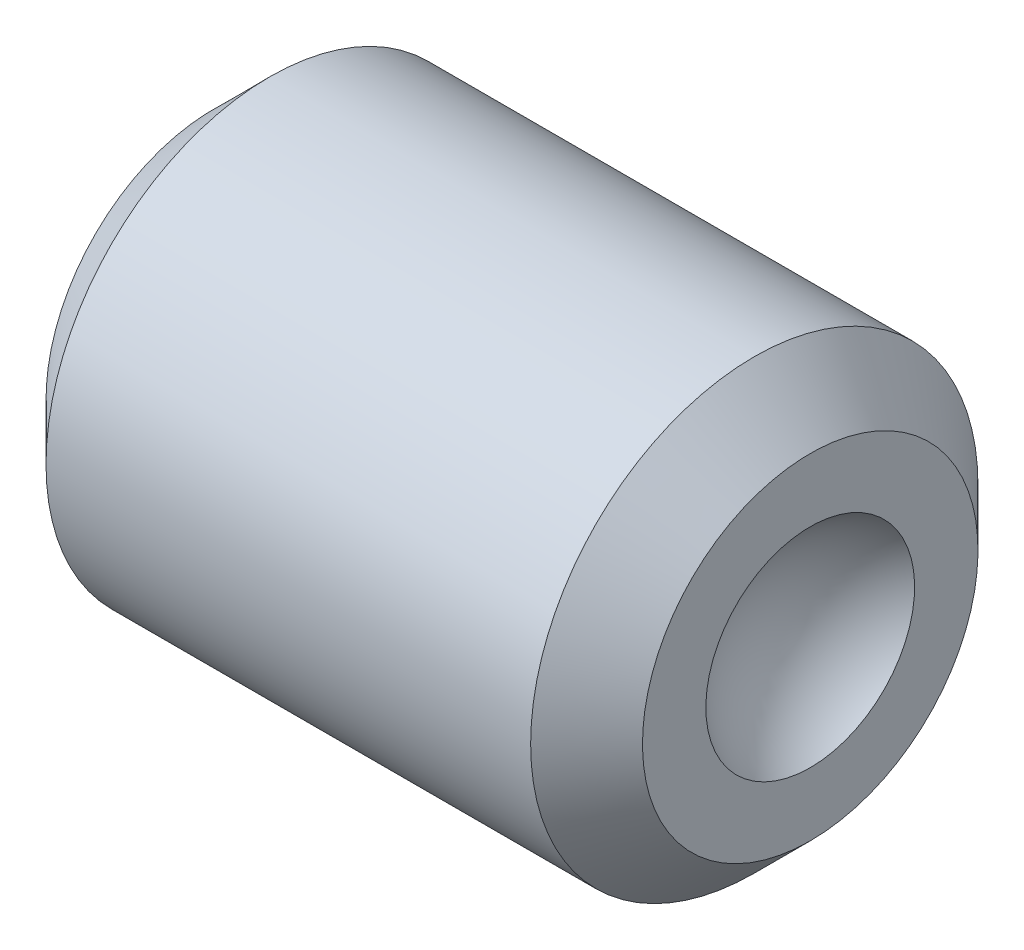
ISO-10303-21;
HEADER;
FILE_DESCRIPTION(('STEP AP214'),'2;1');
FILE_NAME('part.step','',(''),(''),'','','');
FILE_SCHEMA(('AUTOMOTIVE_DESIGN { 1 0 10303 214 1 1 1 1 }'));
ENDSEC;
DATA;
#1=APPLICATION_CONTEXT('core data for automotive mechanical design processes');
#2=APPLICATION_PROTOCOL_DEFINITION('international standard','automotive_design',2000,#1);
#3=PRODUCT_CONTEXT('',#1,'mechanical');
#4=PRODUCT('Part','Part','',(#3));
#5=PRODUCT_RELATED_PRODUCT_CATEGORY('part','',(#4));
#6=PRODUCT_DEFINITION_FORMATION('','',#4);
#7=PRODUCT_DEFINITION_CONTEXT('part definition',#1,'design');
#8=PRODUCT_DEFINITION('design','',#6,#7);
#9=PRODUCT_DEFINITION_SHAPE('','',#8);
#10=(LENGTH_UNIT() NAMED_UNIT(*) SI_UNIT(.MILLI.,.METRE.));
#11=(NAMED_UNIT(*) PLANE_ANGLE_UNIT() SI_UNIT($,.RADIAN.));
#12=(NAMED_UNIT(*) SI_UNIT($,.STERADIAN.) SOLID_ANGLE_UNIT());
#13=UNCERTAINTY_MEASURE_WITH_UNIT(LENGTH_MEASURE(1.E-05),#10,'distance_accuracy_value','');
#14=(GEOMETRIC_REPRESENTATION_CONTEXT(3) GLOBAL_UNCERTAINTY_ASSIGNED_CONTEXT((#13)) GLOBAL_UNIT_ASSIGNED_CONTEXT((#10,
#11,#12)) REPRESENTATION_CONTEXT('',''));
#15=CARTESIAN_POINT('',(0.,0.,0.));
#16=DIRECTION('',(0.,0.,1.));
#17=DIRECTION('',(1.,0.,0.));
#18=AXIS2_PLACEMENT_3D('',#15,#16,#17);
#19=CARTESIAN_POINT('',(0.,0.,0.));
#20=DIRECTION('',(1.,0.,0.));
#21=DIRECTION('',(0.,1.,0.));
#22=AXIS2_PLACEMENT_3D('',#19,#20,#21);
#23=PLANE('',#22);
#24=DIRECTION('',(0.,-0.5,-0.866025403784439));
#25=VECTOR('',#24,1.);
#26=CARTESIAN_POINT('',(0.,0.866025403784439,0.));
#27=LINE('',#26,#25);
#28=CARTESIAN_POINT('',(0.,0.866025403784439,0.));
#29=VERTEX_POINT('',#28);
#30=CARTESIAN_POINT('',(0.,0.43301270189222,-0.75));
#31=VERTEX_POINT('',#30);
#32=EDGE_CURVE('E107',#29,#31,#27,.T.);
#33=ORIENTED_EDGE('',*,*,#32,.F.);
#34=DIRECTION('',(0.,0.5,-0.866025403784439));
#35=VECTOR('',#34,1.);
#36=CARTESIAN_POINT('',(0.,0.433012701892219,0.75));
#37=LINE('',#36,#35);
#38=CARTESIAN_POINT('',(0.,0.433012701892219,0.75));
#39=VERTEX_POINT('',#38);
#40=EDGE_CURVE('E49',#39,#29,#37,.T.);
#41=ORIENTED_EDGE('',*,*,#40,.F.);
#42=DIRECTION('',(0.,1.,0.));
#43=VECTOR('',#42,1.);
#44=CARTESIAN_POINT('',(0.,-0.43301270189222,0.75));
#45=LINE('',#44,#43);
#46=CARTESIAN_POINT('',(0.,-0.43301270189222,0.75));
#47=VERTEX_POINT('',#46);
#48=EDGE_CURVE('E122',#47,#39,#45,.T.);
#49=ORIENTED_EDGE('',*,*,#48,.F.);
#50=DIRECTION('',(0.,0.5,0.866025403784439));
#51=VECTOR('',#50,1.);
#52=CARTESIAN_POINT('',(0.,-0.866025403784439,0.));
#53=LINE('',#52,#51);
#54=CARTESIAN_POINT('',(0.,-0.866025403784439,0.));
#55=VERTEX_POINT('',#54);
#56=EDGE_CURVE('E116',#55,#47,#53,.T.);
#57=ORIENTED_EDGE('',*,*,#56,.F.);
#58=DIRECTION('',(0.,-0.5,0.866025403784439));
#59=VECTOR('',#58,1.);
#60=CARTESIAN_POINT('',(0.,-0.433012701892219,-0.75));
#61=LINE('',#60,#59);
#62=CARTESIAN_POINT('',(0.,-0.433012701892219,-0.75));
#63=VERTEX_POINT('',#62);
#64=EDGE_CURVE('E114',#63,#55,#61,.T.);
#65=ORIENTED_EDGE('',*,*,#64,.F.);
#66=DIRECTION('',(0.,-1.,0.));
#67=VECTOR('',#66,1.);
#68=CARTESIAN_POINT('',(0.,0.43301270189222,-0.75));
#69=LINE('',#68,#67);
#70=EDGE_CURVE('E100',#31,#63,#69,.T.);
#71=ORIENTED_EDGE('',*,*,#70,.F.);
#72=EDGE_LOOP('',(#33,#41,#49,#57,#65,#71));
#73=FACE_BOUND('',#72,.T.);
#74=CARTESIAN_POINT('',(0.,0.,0.));
#75=DIRECTION('',(-1.,0.,0.));
#76=DIRECTION('',(0.,-1.,0.));
#77=AXIS2_PLACEMENT_3D('',#74,#75,#76);
#78=CIRCLE('',#77,1.125);
#79=CARTESIAN_POINT('',(0.,-1.125,0.));
#80=VERTEX_POINT('',#79);
#81=EDGE_CURVE('E12',#80,#80,#78,.T.);
#82=ORIENTED_EDGE('',*,*,#81,.T.);
#83=EDGE_LOOP('',(#82));
#84=FACE_BOUND('',#83,.T.);
#85=ADVANCED_FACE('F35',(#73,#84),#23,.F.);
#86=CARTESIAN_POINT('',(0.375000000000001,0.,0.));
#87=DIRECTION('',(1.,0.,0.));
#88=DIRECTION('',(0.,1.,0.));
#89=AXIS2_PLACEMENT_3D('',#86,#87,#88);
#90=CONICAL_SURFACE('',#89,1.5,0.785398163397447);
#91=ORIENTED_EDGE('',*,*,#81,.F.);
#92=EDGE_LOOP('',(#91));
#93=FACE_BOUND('',#92,.T.);
#94=CARTESIAN_POINT('',(0.375000000000001,0.,0.));
#95=DIRECTION('',(-1.,0.,0.));
#96=DIRECTION('',(0.,-1.,0.));
#97=AXIS2_PLACEMENT_3D('',#94,#95,#96);
#98=CIRCLE('',#97,1.5);
#99=CARTESIAN_POINT('',(0.375000000000001,-1.5,0.));
#100=VERTEX_POINT('',#99);
#101=EDGE_CURVE('E42',#100,#100,#98,.T.);
#102=ORIENTED_EDGE('',*,*,#101,.T.);
#103=EDGE_LOOP('',(#102));
#104=FACE_BOUND('',#103,.T.);
#105=ADVANCED_FACE('F145',(#93,#104),#90,.T.);
#106=CARTESIAN_POINT('',(0.,0.,0.));
#107=DIRECTION('',(-1.,0.,0.));
#108=DIRECTION('',(0.,-1.,0.));
#109=AXIS2_PLACEMENT_3D('',#106,#107,#108);
#110=CYLINDRICAL_SURFACE('',#109,1.5);
#111=ORIENTED_EDGE('',*,*,#101,.F.);
#112=EDGE_LOOP('',(#111));
#113=FACE_BOUND('',#112,.T.);
#114=CARTESIAN_POINT('',(3.625,0.,0.));
#115=DIRECTION('',(-1.,0.,0.));
#116=DIRECTION('',(0.,-1.,0.));
#117=AXIS2_PLACEMENT_3D('',#114,#115,#116);
#118=CIRCLE('',#117,1.5);
#119=CARTESIAN_POINT('',(3.625,-1.5,0.));
#120=VERTEX_POINT('',#119);
#121=EDGE_CURVE('E140',#120,#120,#118,.T.);
#122=ORIENTED_EDGE('',*,*,#121,.T.);
#123=EDGE_LOOP('',(#122));
#124=FACE_BOUND('',#123,.T.);
#125=ADVANCED_FACE('F147',(#113,#124),#110,.T.);
#126=CARTESIAN_POINT('',(4.,0.,0.));
#127=DIRECTION('',(-1.,0.,0.));
#128=DIRECTION('',(0.,-1.,0.));
#129=AXIS2_PLACEMENT_3D('',#126,#127,#128);
#130=CONICAL_SURFACE('',#129,1.125,0.785398163397451);
#131=ORIENTED_EDGE('',*,*,#121,.F.);
#132=EDGE_LOOP('',(#131));
#133=FACE_BOUND('',#132,.T.);
#134=CARTESIAN_POINT('',(4.,0.,0.));
#135=DIRECTION('',(-1.,0.,0.));
#136=DIRECTION('',(0.,-1.,0.));
#137=AXIS2_PLACEMENT_3D('',#134,#135,#136);
#138=CIRCLE('',#137,1.125);
#139=CARTESIAN_POINT('',(4.,-1.125,0.));
#140=VERTEX_POINT('',#139);
#141=EDGE_CURVE('E137',#140,#140,#138,.T.);
#142=ORIENTED_EDGE('',*,*,#141,.T.);
#143=EDGE_LOOP('',(#142));
#144=FACE_BOUND('',#143,.T.);
#145=ADVANCED_FACE('F150',(#133,#144),#130,.T.);
#146=CARTESIAN_POINT('',(4.,1.125,0.));
#147=DIRECTION('',(-1.,0.,0.));
#148=DIRECTION('',(0.,-1.,0.));
#149=AXIS2_PLACEMENT_3D('',#146,#147,#148);
#150=PLANE('',#149);
#151=ORIENTED_EDGE('',*,*,#141,.F.);
#152=EDGE_LOOP('',(#151));
#153=FACE_BOUND('',#152,.T.);
#154=CARTESIAN_POINT('',(4.,0.,0.));
#155=DIRECTION('',(-1.,0.,0.));
#156=DIRECTION('',(0.,-1.,0.));
#157=AXIS2_PLACEMENT_3D('',#154,#155,#156);
#158=CIRCLE('',#157,0.7);
#159=CARTESIAN_POINT('',(4.,-0.7,0.));
#160=VERTEX_POINT('',#159);
#161=EDGE_CURVE('E134',#160,#160,#158,.T.);
#162=ORIENTED_EDGE('',*,*,#161,.T.);
#163=EDGE_LOOP('',(#162));
#164=FACE_BOUND('',#163,.T.);
#165=ADVANCED_FACE('F156',(#153,#164),#150,.F.);
#166=CARTESIAN_POINT('',(4.46583333333333,0.,0.));
#167=DIRECTION('',(-1.,0.,0.));
#168=DIRECTION('',(0.,-1.,0.));
#169=AXIS2_PLACEMENT_3D('',#166,#167,#168);
#170=SPHERICAL_SURFACE('',#169,0.840833333333333);
#171=ORIENTED_EDGE('',*,*,#161,.F.);
#172=EDGE_LOOP('',(#171));
#173=FACE_BOUND('',#172,.T.);
#174=ADVANCED_FACE('F162',(#173),#170,.F.);
#175=CARTESIAN_POINT('',(6.29128784747792,0.433012701892219,0.75));
#176=DIRECTION('',(0.,0.866025403784438,0.5));
#177=DIRECTION('',(0.,-0.5,0.866025403784439));
#178=AXIS2_PLACEMENT_3D('',#175,#176,#177);
#179=PLANE('',#178);
#180=DIRECTION('',(0.,-0.5,0.866025403784439));
#181=VECTOR('',#180,1.);
#182=CARTESIAN_POINT('',(2.,0.433012701892219,0.75));
#183=LINE('',#182,#181);
#184=CARTESIAN_POINT('',(2.,0.866025403784439,0.));
#185=VERTEX_POINT('',#184);
#186=CARTESIAN_POINT('',(2.,0.433012701892219,0.75));
#187=VERTEX_POINT('',#186);
#188=EDGE_CURVE('E68',#185,#187,#183,.T.);
#189=ORIENTED_EDGE('',*,*,#188,.T.);
#190=DIRECTION('',(-1.,0.,0.));
#191=VECTOR('',#190,1.);
#192=CARTESIAN_POINT('',(6.29128784747792,0.433012701892219,0.75));
#193=LINE('',#192,#191);
#194=EDGE_CURVE('E125',#187,#39,#193,.T.);
#195=ORIENTED_EDGE('',*,*,#194,.T.);
#196=ORIENTED_EDGE('',*,*,#40,.T.);
#197=DIRECTION('',(-1.,0.,0.));
#198=VECTOR('',#197,1.);
#199=CARTESIAN_POINT('',(6.29128784747792,0.866025403784439,0.));
#200=LINE('',#199,#198);
#201=EDGE_CURVE('E104',#185,#29,#200,.T.);
#202=ORIENTED_EDGE('',*,*,#201,.F.);
#203=EDGE_LOOP('',(#189,#195,#196,#202));
#204=FACE_BOUND('',#203,.T.);
#205=ADVANCED_FACE('F167',(#204),#179,.F.);
#206=CARTESIAN_POINT('',(6.29128784747792,-0.43301270189222,0.75));
#207=DIRECTION('',(0.,0.,1.));
#208=DIRECTION('',(0.,-1.,0.));
#209=AXIS2_PLACEMENT_3D('',#206,#207,#208);
#210=PLANE('',#209);
#211=DIRECTION('',(0.,-1.,0.));
#212=VECTOR('',#211,1.);
#213=CARTESIAN_POINT('',(2.,-0.43301270189222,0.75));
#214=LINE('',#213,#212);
#215=CARTESIAN_POINT('',(2.,-0.43301270189222,0.75));
#216=VERTEX_POINT('',#215);
#217=EDGE_CURVE('E267',#187,#216,#214,.T.);
#218=ORIENTED_EDGE('',*,*,#217,.T.);
#219=DIRECTION('',(-1.,0.,0.));
#220=VECTOR('',#219,1.);
#221=CARTESIAN_POINT('',(6.29128784747792,-0.43301270189222,0.75));
#222=LINE('',#221,#220);
#223=EDGE_CURVE('E127',#216,#47,#222,.T.);
#224=ORIENTED_EDGE('',*,*,#223,.T.);
#225=ORIENTED_EDGE('',*,*,#48,.T.);
#226=ORIENTED_EDGE('',*,*,#194,.F.);
#227=EDGE_LOOP('',(#218,#224,#225,#226));
#228=FACE_BOUND('',#227,.T.);
#229=ADVANCED_FACE('F172',(#228),#210,.F.);
#230=CARTESIAN_POINT('',(6.29128784747792,-0.866025403784439,0.));
#231=DIRECTION('',(0.,-0.866025403784439,0.5));
#232=DIRECTION('',(0.,-0.5,-0.866025403784439));
#233=AXIS2_PLACEMENT_3D('',#230,#231,#232);
#234=PLANE('',#233);
#235=DIRECTION('',(0.,-0.5,-0.866025403784439));
#236=VECTOR('',#235,1.);
#237=CARTESIAN_POINT('',(2.,-0.866025403784439,0.));
#238=LINE('',#237,#236);
#239=CARTESIAN_POINT('',(2.,-0.866025403784439,0.));
#240=VERTEX_POINT('',#239);
#241=EDGE_CURVE('E270',#216,#240,#238,.T.);
#242=ORIENTED_EDGE('',*,*,#241,.T.);
#243=DIRECTION('',(-1.,0.,0.));
#244=VECTOR('',#243,1.);
#245=CARTESIAN_POINT('',(6.29128784747792,-0.866025403784439,0.));
#246=LINE('',#245,#244);
#247=EDGE_CURVE('E129',#240,#55,#246,.T.);
#248=ORIENTED_EDGE('',*,*,#247,.T.);
#249=ORIENTED_EDGE('',*,*,#56,.T.);
#250=ORIENTED_EDGE('',*,*,#223,.F.);
#251=EDGE_LOOP('',(#242,#248,#249,#250));
#252=FACE_BOUND('',#251,.T.);
#253=ADVANCED_FACE('F217',(#252),#234,.F.);
#254=CARTESIAN_POINT('',(6.29128784747792,-0.433012701892219,-0.75));
#255=DIRECTION('',(0.,-0.866025403784438,-0.5));
#256=DIRECTION('',(0.,0.5,-0.866025403784439));
#257=AXIS2_PLACEMENT_3D('',#254,#255,#256);
#258=PLANE('',#257);
#259=DIRECTION('',(0.,0.5,-0.866025403784439));
#260=VECTOR('',#259,1.);
#261=CARTESIAN_POINT('',(2.,-0.433012701892219,-0.75));
#262=LINE('',#261,#260);
#263=CARTESIAN_POINT('',(2.,-0.433012701892219,-0.75));
#264=VERTEX_POINT('',#263);
#265=EDGE_CURVE('E58',#240,#264,#262,.T.);
#266=ORIENTED_EDGE('',*,*,#265,.T.);
#267=DIRECTION('',(-1.,0.,0.));
#268=VECTOR('',#267,1.);
#269=CARTESIAN_POINT('',(6.29128784747792,-0.433012701892219,-0.75));
#270=LINE('',#269,#268);
#271=EDGE_CURVE('E103',#264,#63,#270,.T.);
#272=ORIENTED_EDGE('',*,*,#271,.T.);
#273=ORIENTED_EDGE('',*,*,#64,.T.);
#274=ORIENTED_EDGE('',*,*,#247,.F.);
#275=EDGE_LOOP('',(#266,#272,#273,#274));
#276=FACE_BOUND('',#275,.T.);
#277=ADVANCED_FACE('F227',(#276),#258,.F.);
#278=CARTESIAN_POINT('',(6.29128784747792,0.43301270189222,-0.75));
#279=DIRECTION('',(0.,0.,-1.));
#280=DIRECTION('',(-1.,0.,0.));
#281=AXIS2_PLACEMENT_3D('',#278,#279,#280);
#282=PLANE('',#281);
#283=DIRECTION('',(0.,1.,0.));
#284=VECTOR('',#283,1.);
#285=CARTESIAN_POINT('',(2.,0.43301270189222,-0.75));
#286=LINE('',#285,#284);
#287=CARTESIAN_POINT('',(2.,0.43301270189222,-0.75));
#288=VERTEX_POINT('',#287);
#289=EDGE_CURVE('E102',#264,#288,#286,.T.);
#290=ORIENTED_EDGE('',*,*,#289,.T.);
#291=DIRECTION('',(-1.,0.,0.));
#292=VECTOR('',#291,1.);
#293=CARTESIAN_POINT('',(6.29128784747792,0.43301270189222,-0.75));
#294=LINE('',#293,#292);
#295=EDGE_CURVE('E95',#288,#31,#294,.T.);
#296=ORIENTED_EDGE('',*,*,#295,.T.);
#297=ORIENTED_EDGE('',*,*,#70,.T.);
#298=ORIENTED_EDGE('',*,*,#271,.F.);
#299=EDGE_LOOP('',(#290,#296,#297,#298));
#300=FACE_BOUND('',#299,.T.);
#301=ADVANCED_FACE('F97',(#300),#282,.F.);
#302=CARTESIAN_POINT('',(6.29128784747792,0.866025403784439,0.));
#303=DIRECTION('',(0.,0.866025403784439,-0.5));
#304=DIRECTION('',(0.,0.5,0.866025403784439));
#305=AXIS2_PLACEMENT_3D('',#302,#303,#304);
#306=PLANE('',#305);
#307=DIRECTION('',(0.,0.5,0.866025403784439));
#308=VECTOR('',#307,1.);
#309=CARTESIAN_POINT('',(2.,0.866025403784439,0.));
#310=LINE('',#309,#308);
#311=EDGE_CURVE('E77',#288,#185,#310,.T.);
#312=ORIENTED_EDGE('',*,*,#311,.T.);
#313=ORIENTED_EDGE('',*,*,#201,.T.);
#314=ORIENTED_EDGE('',*,*,#32,.T.);
#315=ORIENTED_EDGE('',*,*,#295,.F.);
#316=EDGE_LOOP('',(#312,#313,#314,#315));
#317=FACE_BOUND('',#316,.T.);
#318=ADVANCED_FACE('F108',(#317),#306,.F.);
#319=CARTESIAN_POINT('',(2.,1.125,0.));
#320=DIRECTION('',(-1.,0.,0.));
#321=DIRECTION('',(0.,-1.,0.));
#322=AXIS2_PLACEMENT_3D('',#319,#320,#321);
#323=PLANE('',#322);
#324=ORIENTED_EDGE('',*,*,#188,.F.);
#325=ORIENTED_EDGE('',*,*,#311,.F.);
#326=ORIENTED_EDGE('',*,*,#289,.F.);
#327=ORIENTED_EDGE('',*,*,#265,.F.);
#328=ORIENTED_EDGE('',*,*,#241,.F.);
#329=ORIENTED_EDGE('',*,*,#217,.F.);
#330=EDGE_LOOP('',(#324,#325,#326,#327,#328,#329));
#331=FACE_BOUND('',#330,.T.);
#332=ADVANCED_FACE('F253',(#331),#323,.T.);
#333=CLOSED_SHELL('',(#85,#105,#125,#145,#165,#174,#205,#229,#253,#277,#301,#318,#332));
#334=MANIFOLD_SOLID_BREP('B2',#333);
#335=ADVANCED_BREP_SHAPE_REPRESENTATION('',(#18,#334),#14);
#336=SHAPE_DEFINITION_REPRESENTATION(#9,#335);
ENDSEC;
END-ISO-10303-21;
